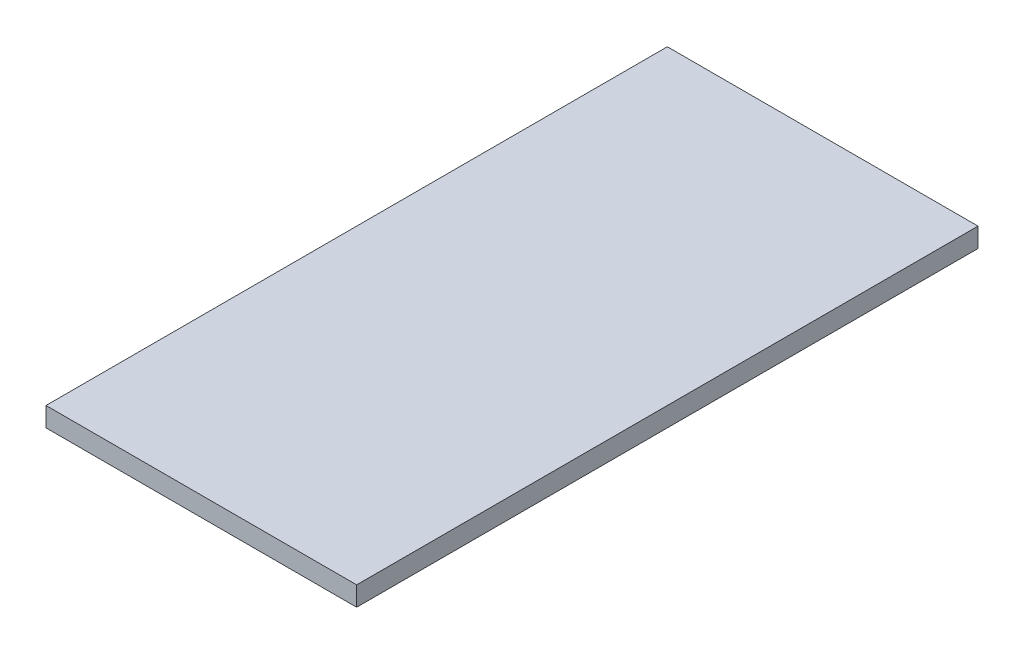
ISO-10303-21;
HEADER;
FILE_DESCRIPTION(('STEP AP214'),'2;1');
FILE_NAME('part.step','',(''),(''),'','','');
FILE_SCHEMA(('AUTOMOTIVE_DESIGN { 1 0 10303 214 1 1 1 1 }'));
ENDSEC;
DATA;
#1=APPLICATION_CONTEXT('core data for automotive mechanical design processes');
#2=APPLICATION_PROTOCOL_DEFINITION('international standard','automotive_design',2000,#1);
#3=PRODUCT_CONTEXT('',#1,'mechanical');
#4=PRODUCT('Part','Part','',(#3));
#5=PRODUCT_RELATED_PRODUCT_CATEGORY('part','',(#4));
#6=PRODUCT_DEFINITION_FORMATION('','',#4);
#7=PRODUCT_DEFINITION_CONTEXT('part definition',#1,'design');
#8=PRODUCT_DEFINITION('design','',#6,#7);
#9=PRODUCT_DEFINITION_SHAPE('','',#8);
#10=(LENGTH_UNIT() NAMED_UNIT(*) SI_UNIT(.MILLI.,.METRE.));
#11=(NAMED_UNIT(*) PLANE_ANGLE_UNIT() SI_UNIT($,.RADIAN.));
#12=(NAMED_UNIT(*) SI_UNIT($,.STERADIAN.) SOLID_ANGLE_UNIT());
#13=UNCERTAINTY_MEASURE_WITH_UNIT(LENGTH_MEASURE(1.E-05),#10,'distance_accuracy_value','');
#14=(GEOMETRIC_REPRESENTATION_CONTEXT(3) GLOBAL_UNCERTAINTY_ASSIGNED_CONTEXT((#13)) GLOBAL_UNIT_ASSIGNED_CONTEXT((#10,
#11,#12)) REPRESENTATION_CONTEXT('',''));
#15=CARTESIAN_POINT('',(0.,0.,0.));
#16=DIRECTION('',(0.,0.,1.));
#17=DIRECTION('',(1.,0.,0.));
#18=AXIS2_PLACEMENT_3D('',#15,#16,#17);
#19=CARTESIAN_POINT('',(0.,12.7,0.));
#20=DIRECTION('',(1.,0.,0.));
#21=DIRECTION('',(0.,0.,-1.));
#22=AXIS2_PLACEMENT_3D('',#19,#20,#21);
#23=PLANE('',#22);
#24=DIRECTION('',(0.,0.,1.));
#25=VECTOR('',#24,1.);
#26=CARTESIAN_POINT('',(0.,0.,0.));
#27=LINE('',#26,#25);
#28=CARTESIAN_POINT('',(-2.22044604925031E-13,0.,-406.4));
#29=VERTEX_POINT('',#28);
#30=CARTESIAN_POINT('',(0.,0.,0.));
#31=VERTEX_POINT('',#30);
#32=EDGE_CURVE('E96',#29,#31,#27,.T.);
#33=ORIENTED_EDGE('',*,*,#32,.T.);
#34=DIRECTION('',(0.,-1.,0.));
#35=VECTOR('',#34,1.);
#36=CARTESIAN_POINT('',(0.,12.7,0.));
#37=LINE('',#36,#35);
#38=CARTESIAN_POINT('',(0.,12.7,0.));
#39=VERTEX_POINT('',#38);
#40=EDGE_CURVE('E11',#39,#31,#37,.T.);
#41=ORIENTED_EDGE('',*,*,#40,.F.);
#42=DIRECTION('',(0.,0.,1.));
#43=VECTOR('',#42,1.);
#44=CARTESIAN_POINT('',(0.,12.7,0.));
#45=LINE('',#44,#43);
#46=CARTESIAN_POINT('',(-2.22044604925031E-13,12.7,-406.4));
#47=VERTEX_POINT('',#46);
#48=EDGE_CURVE('E84',#47,#39,#45,.T.);
#49=ORIENTED_EDGE('',*,*,#48,.F.);
#50=DIRECTION('',(0.,-1.,0.));
#51=VECTOR('',#50,1.);
#52=CARTESIAN_POINT('',(-2.22044604925031E-13,12.7,-406.4));
#53=LINE('',#52,#51);
#54=EDGE_CURVE('E92',#47,#29,#53,.T.);
#55=ORIENTED_EDGE('',*,*,#54,.T.);
#56=EDGE_LOOP('',(#33,#41,#49,#55));
#57=FACE_BOUND('',#56,.T.);
#58=ADVANCED_FACE('F33',(#57),#23,.F.);
#59=CARTESIAN_POINT('',(0.,12.7,0.));
#60=DIRECTION('',(0.,0.,-1.));
#61=DIRECTION('',(-1.,0.,0.));
#62=AXIS2_PLACEMENT_3D('',#59,#60,#61);
#63=PLANE('',#62);
#64=DIRECTION('',(1.,0.,0.));
#65=VECTOR('',#64,1.);
#66=CARTESIAN_POINT('',(0.,0.,0.));
#67=LINE('',#66,#65);
#68=CARTESIAN_POINT('',(203.2,0.,0.));
#69=VERTEX_POINT('',#68);
#70=EDGE_CURVE('E88',#31,#69,#67,.T.);
#71=ORIENTED_EDGE('',*,*,#70,.T.);
#72=DIRECTION('',(0.,-1.,0.));
#73=VECTOR('',#72,1.);
#74=CARTESIAN_POINT('',(203.2,12.7,0.));
#75=LINE('',#74,#73);
#76=CARTESIAN_POINT('',(203.2,12.7,0.));
#77=VERTEX_POINT('',#76);
#78=EDGE_CURVE('E41',#77,#69,#75,.T.);
#79=ORIENTED_EDGE('',*,*,#78,.F.);
#80=DIRECTION('',(1.,0.,0.));
#81=VECTOR('',#80,1.);
#82=CARTESIAN_POINT('',(0.,12.7,0.));
#83=LINE('',#82,#81);
#84=EDGE_CURVE('E79',#39,#77,#83,.T.);
#85=ORIENTED_EDGE('',*,*,#84,.F.);
#86=ORIENTED_EDGE('',*,*,#40,.T.);
#87=EDGE_LOOP('',(#71,#79,#85,#86));
#88=FACE_BOUND('',#87,.T.);
#89=ADVANCED_FACE('F87',(#88),#63,.F.);
#90=CARTESIAN_POINT('',(203.2,12.7,0.));
#91=DIRECTION('',(-1.,0.,0.));
#92=DIRECTION('',(0.,0.,1.));
#93=AXIS2_PLACEMENT_3D('',#90,#91,#92);
#94=PLANE('',#93);
#95=DIRECTION('',(0.,0.,-1.));
#96=VECTOR('',#95,1.);
#97=CARTESIAN_POINT('',(203.2,0.,0.));
#98=LINE('',#97,#96);
#99=CARTESIAN_POINT('',(203.2,0.,-406.4));
#100=VERTEX_POINT('',#99);
#101=EDGE_CURVE('E66',#69,#100,#98,.T.);
#102=ORIENTED_EDGE('',*,*,#101,.T.);
#103=DIRECTION('',(0.,-1.,0.));
#104=VECTOR('',#103,1.);
#105=CARTESIAN_POINT('',(203.2,12.7,-406.4));
#106=LINE('',#105,#104);
#107=CARTESIAN_POINT('',(203.2,12.7,-406.4));
#108=VERTEX_POINT('',#107);
#109=EDGE_CURVE('E89',#108,#100,#106,.T.);
#110=ORIENTED_EDGE('',*,*,#109,.F.);
#111=DIRECTION('',(0.,0.,-1.));
#112=VECTOR('',#111,1.);
#113=CARTESIAN_POINT('',(203.2,12.7,0.));
#114=LINE('',#113,#112);
#115=EDGE_CURVE('E82',#77,#108,#114,.T.);
#116=ORIENTED_EDGE('',*,*,#115,.F.);
#117=ORIENTED_EDGE('',*,*,#78,.T.);
#118=EDGE_LOOP('',(#102,#110,#116,#117));
#119=FACE_BOUND('',#118,.T.);
#120=ADVANCED_FACE('F90',(#119),#94,.F.);
#121=CARTESIAN_POINT('',(-2.22044604925031E-13,12.7,-406.4));
#122=DIRECTION('',(0.,0.,1.));
#123=DIRECTION('',(1.,0.,0.));
#124=AXIS2_PLACEMENT_3D('',#121,#122,#123);
#125=PLANE('',#124);
#126=DIRECTION('',(-1.,0.,0.));
#127=VECTOR('',#126,1.);
#128=CARTESIAN_POINT('',(-2.22044604925031E-13,0.,-406.4));
#129=LINE('',#128,#127);
#130=EDGE_CURVE('E72',#100,#29,#129,.T.);
#131=ORIENTED_EDGE('',*,*,#130,.T.);
#132=ORIENTED_EDGE('',*,*,#54,.F.);
#133=DIRECTION('',(-1.,0.,0.));
#134=VECTOR('',#133,1.);
#135=CARTESIAN_POINT('',(-2.22044604925031E-13,12.7,-406.4));
#136=LINE('',#135,#134);
#137=EDGE_CURVE('E49',#108,#47,#136,.T.);
#138=ORIENTED_EDGE('',*,*,#137,.F.);
#139=ORIENTED_EDGE('',*,*,#109,.T.);
#140=EDGE_LOOP('',(#131,#132,#138,#139));
#141=FACE_BOUND('',#140,.T.);
#142=ADVANCED_FACE('F103',(#141),#125,.F.);
#143=CARTESIAN_POINT('',(0.,12.7,0.));
#144=DIRECTION('',(0.,-1.,0.));
#145=DIRECTION('',(0.,0.,-1.));
#146=AXIS2_PLACEMENT_3D('',#143,#144,#145);
#147=PLANE('',#146);
#148=ORIENTED_EDGE('',*,*,#48,.T.);
#149=ORIENTED_EDGE('',*,*,#84,.T.);
#150=ORIENTED_EDGE('',*,*,#115,.T.);
#151=ORIENTED_EDGE('',*,*,#137,.T.);
#152=EDGE_LOOP('',(#148,#149,#150,#151));
#153=FACE_BOUND('',#152,.T.);
#154=ADVANCED_FACE('F80',(#153),#147,.F.);
#155=CARTESIAN_POINT('',(0.,0.,0.));
#156=DIRECTION('',(0.,-1.,0.));
#157=DIRECTION('',(0.,0.,-1.));
#158=AXIS2_PLACEMENT_3D('',#155,#156,#157);
#159=PLANE('',#158);
#160=ORIENTED_EDGE('',*,*,#32,.F.);
#161=ORIENTED_EDGE('',*,*,#130,.F.);
#162=ORIENTED_EDGE('',*,*,#101,.F.);
#163=ORIENTED_EDGE('',*,*,#70,.F.);
#164=EDGE_LOOP('',(#160,#161,#162,#163));
#165=FACE_BOUND('',#164,.T.);
#166=ADVANCED_FACE('F106',(#165),#159,.T.);
#167=CLOSED_SHELL('',(#58,#89,#120,#142,#154,#166));
#168=MANIFOLD_SOLID_BREP('B2',#167);
#169=ADVANCED_BREP_SHAPE_REPRESENTATION('',(#18,#168),#14);
#170=SHAPE_DEFINITION_REPRESENTATION(#9,#169);
ENDSEC;
END-ISO-10303-21;
